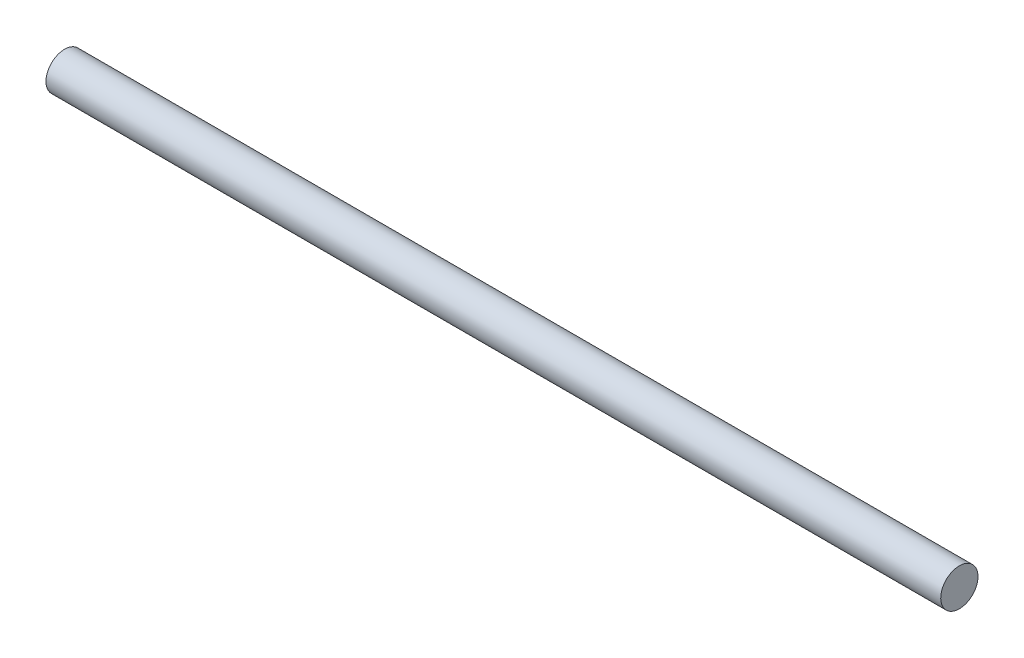
ISO-10303-21;
HEADER;
FILE_DESCRIPTION(('STEP AP214'),'2;1');
FILE_NAME('part.step','',(''),(''),'','','');
FILE_SCHEMA(('AUTOMOTIVE_DESIGN { 1 0 10303 214 1 1 1 1 }'));
ENDSEC;
DATA;
#1=APPLICATION_CONTEXT('core data for automotive mechanical design processes');
#2=APPLICATION_PROTOCOL_DEFINITION('international standard','automotive_design',2000,#1);
#3=PRODUCT_CONTEXT('',#1,'mechanical');
#4=PRODUCT('Part','Part','',(#3));
#5=PRODUCT_RELATED_PRODUCT_CATEGORY('part','',(#4));
#6=PRODUCT_DEFINITION_FORMATION('','',#4);
#7=PRODUCT_DEFINITION_CONTEXT('part definition',#1,'design');
#8=PRODUCT_DEFINITION('design','',#6,#7);
#9=PRODUCT_DEFINITION_SHAPE('','',#8);
#10=(LENGTH_UNIT() NAMED_UNIT(*) SI_UNIT(.MILLI.,.METRE.));
#11=(NAMED_UNIT(*) PLANE_ANGLE_UNIT() SI_UNIT($,.RADIAN.));
#12=(NAMED_UNIT(*) SI_UNIT($,.STERADIAN.) SOLID_ANGLE_UNIT());
#13=UNCERTAINTY_MEASURE_WITH_UNIT(LENGTH_MEASURE(1.E-05),#10,'distance_accuracy_value','');
#14=(GEOMETRIC_REPRESENTATION_CONTEXT(3) GLOBAL_UNCERTAINTY_ASSIGNED_CONTEXT((#13)) GLOBAL_UNIT_ASSIGNED_CONTEXT((#10,
#11,#12)) REPRESENTATION_CONTEXT('',''));
#15=CARTESIAN_POINT('',(0.,0.,0.));
#16=DIRECTION('',(0.,0.,1.));
#17=DIRECTION('',(1.,0.,0.));
#18=AXIS2_PLACEMENT_3D('',#15,#16,#17);
#19=CARTESIAN_POINT('',(0.,0.,0.));
#20=DIRECTION('',(1.,0.,0.));
#21=DIRECTION('',(0.,0.,-1.));
#22=AXIS2_PLACEMENT_3D('',#19,#20,#21);
#23=CYLINDRICAL_SURFACE('',#22,0.5);
#24=CARTESIAN_POINT('',(-12.,0.,0.));
#25=DIRECTION('',(1.,0.,0.));
#26=DIRECTION('',(0.,0.,-1.));
#27=AXIS2_PLACEMENT_3D('',#24,#25,#26);
#28=CIRCLE('',#27,0.5);
#29=CARTESIAN_POINT('',(-12.,0.,-0.5));
#30=VERTEX_POINT('',#29);
#31=EDGE_CURVE('E10',#30,#30,#28,.T.);
#32=ORIENTED_EDGE('',*,*,#31,.T.);
#33=EDGE_LOOP('',(#32));
#34=FACE_BOUND('',#33,.T.);
#35=CARTESIAN_POINT('',(12.,0.,0.));
#36=DIRECTION('',(1.,0.,0.));
#37=DIRECTION('',(0.,1.,0.));
#38=AXIS2_PLACEMENT_3D('',#35,#36,#37);
#39=CIRCLE('',#38,0.5);
#40=CARTESIAN_POINT('',(12.,0.5,0.));
#41=VERTEX_POINT('',#40);
#42=EDGE_CURVE('E39',#41,#41,#39,.T.);
#43=ORIENTED_EDGE('',*,*,#42,.F.);
#44=EDGE_LOOP('',(#43));
#45=FACE_BOUND('',#44,.T.);
#46=ADVANCED_FACE('F33',(#34,#45),#23,.T.);
#47=CARTESIAN_POINT('',(-12.,0.,0.));
#48=DIRECTION('',(1.,0.,0.));
#49=DIRECTION('',(0.,0.,-1.));
#50=AXIS2_PLACEMENT_3D('',#47,#48,#49);
#51=PLANE('',#50);
#52=ORIENTED_EDGE('',*,*,#31,.F.);
#53=EDGE_LOOP('',(#52));
#54=FACE_BOUND('',#53,.T.);
#55=ADVANCED_FACE('F48',(#54),#51,.F.);
#56=CARTESIAN_POINT('',(12.,0.5,0.));
#57=DIRECTION('',(1.,0.,0.));
#58=DIRECTION('',(0.,1.,0.));
#59=AXIS2_PLACEMENT_3D('',#56,#57,#58);
#60=PLANE('',#59);
#61=ORIENTED_EDGE('',*,*,#42,.T.);
#62=EDGE_LOOP('',(#61));
#63=FACE_BOUND('',#62,.T.);
#64=ADVANCED_FACE('F45',(#63),#60,.T.);
#65=CLOSED_SHELL('',(#46,#55,#64));
#66=MANIFOLD_SOLID_BREP('B2',#65);
#67=ADVANCED_BREP_SHAPE_REPRESENTATION('',(#18,#66),#14);
#68=SHAPE_DEFINITION_REPRESENTATION(#9,#67);
ENDSEC;
END-ISO-10303-21;
